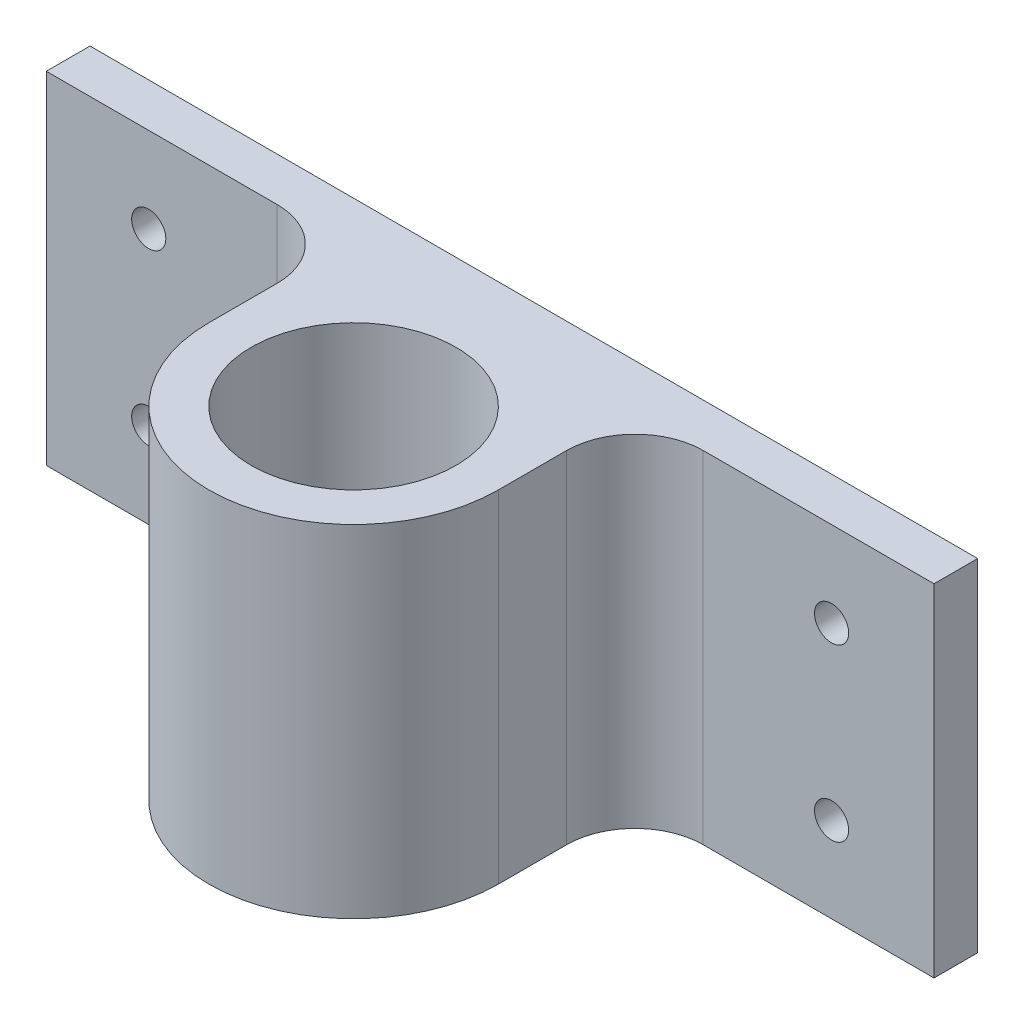
ISO-10303-21;
HEADER;
FILE_DESCRIPTION(('STEP AP214'),'2;1');
FILE_NAME('part.step','',(''),(''),'','','');
FILE_SCHEMA(('AUTOMOTIVE_DESIGN { 1 0 10303 214 1 1 1 1 }'));
ENDSEC;
DATA;
#1=APPLICATION_CONTEXT('core data for automotive mechanical design processes');
#2=APPLICATION_PROTOCOL_DEFINITION('international standard','automotive_design',2000,#1);
#3=PRODUCT_CONTEXT('',#1,'mechanical');
#4=PRODUCT('Part','Part','',(#3));
#5=PRODUCT_RELATED_PRODUCT_CATEGORY('part','',(#4));
#6=PRODUCT_DEFINITION_FORMATION('','',#4);
#7=PRODUCT_DEFINITION_CONTEXT('part definition',#1,'design');
#8=PRODUCT_DEFINITION('design','',#6,#7);
#9=PRODUCT_DEFINITION_SHAPE('','',#8);
#10=(LENGTH_UNIT() NAMED_UNIT(*) SI_UNIT(.MILLI.,.METRE.));
#11=(NAMED_UNIT(*) PLANE_ANGLE_UNIT() SI_UNIT($,.RADIAN.));
#12=(NAMED_UNIT(*) SI_UNIT($,.STERADIAN.) SOLID_ANGLE_UNIT());
#13=UNCERTAINTY_MEASURE_WITH_UNIT(LENGTH_MEASURE(1.E-05),#10,'distance_accuracy_value','');
#14=(GEOMETRIC_REPRESENTATION_CONTEXT(3) GLOBAL_UNCERTAINTY_ASSIGNED_CONTEXT((#13)) GLOBAL_UNIT_ASSIGNED_CONTEXT((#10,
#11,#12)) REPRESENTATION_CONTEXT('',''));
#15=CARTESIAN_POINT('',(0.,0.,0.));
#16=DIRECTION('',(0.,0.,1.));
#17=DIRECTION('',(1.,0.,0.));
#18=AXIS2_PLACEMENT_3D('',#15,#16,#17);
#19=CARTESIAN_POINT('',(-156.,250.,-50.));
#20=DIRECTION('',(0.,1.,0.));
#21=DIRECTION('',(0.,0.,1.));
#22=AXIS2_PLACEMENT_3D('',#19,#20,#21);
#23=PLANE('',#22);
#24=DIRECTION('',(0.,0.,1.));
#25=VECTOR('',#24,1.);
#26=CARTESIAN_POINT('',(-325.,250.,-132.));
#27=LINE('',#26,#25);
#28=CARTESIAN_POINT('',(-325.,250.,-132.));
#29=VERTEX_POINT('',#28);
#30=CARTESIAN_POINT('',(-325.,250.,-100.));
#31=VERTEX_POINT('',#30);
#32=EDGE_CURVE('E165',#29,#31,#27,.T.);
#33=ORIENTED_EDGE('',*,*,#32,.T.);
#34=DIRECTION('',(1.,0.,0.));
#35=VECTOR('',#34,1.);
#36=CARTESIAN_POINT('',(-325.,250.,-100.));
#37=LINE('',#36,#35);
#38=CARTESIAN_POINT('',(-156.,250.,-100.));
#39=VERTEX_POINT('',#38);
#40=EDGE_CURVE('E103',#31,#39,#37,.T.);
#41=ORIENTED_EDGE('',*,*,#40,.T.);
#42=CARTESIAN_POINT('',(-156.,250.,-50.));
#43=DIRECTION('',(0.,-1.,0.));
#44=DIRECTION('',(0.,0.,1.));
#45=AXIS2_PLACEMENT_3D('',#42,#43,#44);
#46=CIRCLE('',#45,50.);
#47=CARTESIAN_POINT('',(-106.,250.,-50.));
#48=VERTEX_POINT('',#47);
#49=EDGE_CURVE('E186',#39,#48,#46,.T.);
#50=ORIENTED_EDGE('',*,*,#49,.T.);
#51=DIRECTION('',(0.,0.,1.));
#52=VECTOR('',#51,1.);
#53=CARTESIAN_POINT('',(-106.,250.,0.));
#54=LINE('',#53,#52);
#55=CARTESIAN_POINT('',(-106.,250.,0.));
#56=VERTEX_POINT('',#55);
#57=EDGE_CURVE('E205',#48,#56,#54,.T.);
#58=ORIENTED_EDGE('',*,*,#57,.T.);
#59=CARTESIAN_POINT('',(0.,250.,0.));
#60=DIRECTION('',(0.,1.,0.));
#61=DIRECTION('',(0.,0.,1.));
#62=AXIS2_PLACEMENT_3D('',#59,#60,#61);
#63=CIRCLE('',#62,106.);
#64=CARTESIAN_POINT('',(106.,250.,0.));
#65=VERTEX_POINT('',#64);
#66=EDGE_CURVE('E202',#56,#65,#63,.T.);
#67=ORIENTED_EDGE('',*,*,#66,.T.);
#68=DIRECTION('',(0.,0.,-1.));
#69=VECTOR('',#68,1.);
#70=CARTESIAN_POINT('',(106.,250.,0.));
#71=LINE('',#70,#69);
#72=CARTESIAN_POINT('',(106.,250.,-50.));
#73=VERTEX_POINT('',#72);
#74=EDGE_CURVE('E204',#65,#73,#71,.T.);
#75=ORIENTED_EDGE('',*,*,#74,.T.);
#76=CARTESIAN_POINT('',(156.,250.,-50.));
#77=DIRECTION('',(0.,-1.,0.));
#78=DIRECTION('',(0.,0.,-1.));
#79=AXIS2_PLACEMENT_3D('',#76,#77,#78);
#80=CIRCLE('',#79,50.);
#81=CARTESIAN_POINT('',(156.,250.,-100.));
#82=VERTEX_POINT('',#81);
#83=EDGE_CURVE('E128',#73,#82,#80,.T.);
#84=ORIENTED_EDGE('',*,*,#83,.T.);
#85=DIRECTION('',(1.,0.,0.));
#86=VECTOR('',#85,1.);
#87=CARTESIAN_POINT('',(156.,250.,-100.));
#88=LINE('',#87,#86);
#89=CARTESIAN_POINT('',(325.,250.,-100.));
#90=VERTEX_POINT('',#89);
#91=EDGE_CURVE('E122',#82,#90,#88,.T.);
#92=ORIENTED_EDGE('',*,*,#91,.T.);
#93=DIRECTION('',(0.,0.,-1.));
#94=VECTOR('',#93,1.);
#95=CARTESIAN_POINT('',(325.,250.,-132.));
#96=LINE('',#95,#94);
#97=CARTESIAN_POINT('',(325.,250.,-132.));
#98=VERTEX_POINT('',#97);
#99=EDGE_CURVE('E126',#90,#98,#96,.T.);
#100=ORIENTED_EDGE('',*,*,#99,.T.);
#101=DIRECTION('',(-1.,0.,0.));
#102=VECTOR('',#101,1.);
#103=CARTESIAN_POINT('',(-325.,250.,-132.));
#104=LINE('',#103,#102);
#105=EDGE_CURVE('E54',#98,#29,#104,.T.);
#106=ORIENTED_EDGE('',*,*,#105,.T.);
#107=EDGE_LOOP('',(#33,#41,#50,#58,#67,#75,#84,#92,#100,#106));
#108=FACE_BOUND('',#107,.T.);
#109=CARTESIAN_POINT('',(0.,250.,0.));
#110=DIRECTION('',(0.,1.,0.));
#111=DIRECTION('',(0.,0.,1.));
#112=AXIS2_PLACEMENT_3D('',#109,#110,#111);
#113=CIRCLE('',#112,75.);
#114=CARTESIAN_POINT('',(0.,250.,75.));
#115=VERTEX_POINT('',#114);
#116=EDGE_CURVE('E150',#115,#115,#113,.T.);
#117=ORIENTED_EDGE('',*,*,#116,.F.);
#118=EDGE_LOOP('',(#117));
#119=FACE_BOUND('',#118,.T.);
#120=ADVANCED_FACE('F37',(#108,#119),#23,.T.);
#121=CARTESIAN_POINT('',(-156.,0.,-50.));
#122=DIRECTION('',(0.,1.,0.));
#123=DIRECTION('',(0.,0.,1.));
#124=AXIS2_PLACEMENT_3D('',#121,#122,#123);
#125=PLANE('',#124);
#126=DIRECTION('',(0.,0.,1.));
#127=VECTOR('',#126,1.);
#128=CARTESIAN_POINT('',(-325.,0.,-132.));
#129=LINE('',#128,#127);
#130=CARTESIAN_POINT('',(-325.,0.,-132.));
#131=VERTEX_POINT('',#130);
#132=CARTESIAN_POINT('',(-325.,0.,-100.));
#133=VERTEX_POINT('',#132);
#134=EDGE_CURVE('E146',#131,#133,#129,.T.);
#135=ORIENTED_EDGE('',*,*,#134,.F.);
#136=DIRECTION('',(-1.,0.,0.));
#137=VECTOR('',#136,1.);
#138=CARTESIAN_POINT('',(-325.,0.,-132.));
#139=LINE('',#138,#137);
#140=CARTESIAN_POINT('',(325.,0.,-132.));
#141=VERTEX_POINT('',#140);
#142=EDGE_CURVE('E95',#141,#131,#139,.T.);
#143=ORIENTED_EDGE('',*,*,#142,.F.);
#144=DIRECTION('',(0.,0.,-1.));
#145=VECTOR('',#144,1.);
#146=CARTESIAN_POINT('',(325.,0.,-132.));
#147=LINE('',#146,#145);
#148=CARTESIAN_POINT('',(325.,0.,-100.));
#149=VERTEX_POINT('',#148);
#150=EDGE_CURVE('E89',#149,#141,#147,.T.);
#151=ORIENTED_EDGE('',*,*,#150,.F.);
#152=DIRECTION('',(1.,0.,0.));
#153=VECTOR('',#152,1.);
#154=CARTESIAN_POINT('',(156.,0.,-100.));
#155=LINE('',#154,#153);
#156=CARTESIAN_POINT('',(156.,0.,-100.));
#157=VERTEX_POINT('',#156);
#158=EDGE_CURVE('E136',#157,#149,#155,.T.);
#159=ORIENTED_EDGE('',*,*,#158,.F.);
#160=CARTESIAN_POINT('',(156.,0.,-50.));
#161=DIRECTION('',(0.,-1.,0.));
#162=DIRECTION('',(0.,0.,-1.));
#163=AXIS2_PLACEMENT_3D('',#160,#161,#162);
#164=CIRCLE('',#163,50.);
#165=CARTESIAN_POINT('',(106.,0.,-50.));
#166=VERTEX_POINT('',#165);
#167=EDGE_CURVE('E160',#166,#157,#164,.T.);
#168=ORIENTED_EDGE('',*,*,#167,.F.);
#169=DIRECTION('',(0.,0.,-1.));
#170=VECTOR('',#169,1.);
#171=CARTESIAN_POINT('',(106.,0.,0.));
#172=LINE('',#171,#170);
#173=CARTESIAN_POINT('',(106.,0.,0.));
#174=VERTEX_POINT('',#173);
#175=EDGE_CURVE('E158',#174,#166,#172,.T.);
#176=ORIENTED_EDGE('',*,*,#175,.F.);
#177=CARTESIAN_POINT('',(0.,0.,0.));
#178=DIRECTION('',(0.,1.,0.));
#179=DIRECTION('',(0.,0.,1.));
#180=AXIS2_PLACEMENT_3D('',#177,#178,#179);
#181=CIRCLE('',#180,106.);
#182=CARTESIAN_POINT('',(-106.,0.,0.));
#183=VERTEX_POINT('',#182);
#184=EDGE_CURVE('E156',#183,#174,#181,.T.);
#185=ORIENTED_EDGE('',*,*,#184,.F.);
#186=DIRECTION('',(0.,0.,1.));
#187=VECTOR('',#186,1.);
#188=CARTESIAN_POINT('',(-106.,0.,0.));
#189=LINE('',#188,#187);
#190=CARTESIAN_POINT('',(-106.,0.,-50.));
#191=VERTEX_POINT('',#190);
#192=EDGE_CURVE('E154',#191,#183,#189,.T.);
#193=ORIENTED_EDGE('',*,*,#192,.F.);
#194=CARTESIAN_POINT('',(-156.,0.,-50.));
#195=DIRECTION('',(0.,-1.,0.));
#196=DIRECTION('',(0.,0.,1.));
#197=AXIS2_PLACEMENT_3D('',#194,#195,#196);
#198=CIRCLE('',#197,50.);
#199=CARTESIAN_POINT('',(-156.,0.,-100.));
#200=VERTEX_POINT('',#199);
#201=EDGE_CURVE('E152',#200,#191,#198,.T.);
#202=ORIENTED_EDGE('',*,*,#201,.F.);
#203=DIRECTION('',(1.,0.,0.));
#204=VECTOR('',#203,1.);
#205=CARTESIAN_POINT('',(-325.,0.,-100.));
#206=LINE('',#205,#204);
#207=EDGE_CURVE('E149',#133,#200,#206,.T.);
#208=ORIENTED_EDGE('',*,*,#207,.F.);
#209=EDGE_LOOP('',(#135,#143,#151,#159,#168,#176,#185,#193,#202,#208));
#210=FACE_BOUND('',#209,.T.);
#211=CARTESIAN_POINT('',(0.,0.,0.));
#212=DIRECTION('',(0.,1.,0.));
#213=DIRECTION('',(0.,0.,1.));
#214=AXIS2_PLACEMENT_3D('',#211,#212,#213);
#215=CIRCLE('',#214,75.);
#216=CARTESIAN_POINT('',(0.,0.,75.));
#217=VERTEX_POINT('',#216);
#218=EDGE_CURVE('E213',#217,#217,#215,.T.);
#219=ORIENTED_EDGE('',*,*,#218,.T.);
#220=EDGE_LOOP('',(#219));
#221=FACE_BOUND('',#220,.T.);
#222=ADVANCED_FACE('F190',(#210,#221),#125,.F.);
#223=CARTESIAN_POINT('',(-325.,250.,-132.));
#224=DIRECTION('',(1.,0.,0.));
#225=DIRECTION('',(0.,0.,-1.));
#226=AXIS2_PLACEMENT_3D('',#223,#224,#225);
#227=PLANE('',#226);
#228=ORIENTED_EDGE('',*,*,#134,.T.);
#229=DIRECTION('',(0.,-1.,0.));
#230=VECTOR('',#229,1.);
#231=CARTESIAN_POINT('',(-325.,250.,-100.));
#232=LINE('',#231,#230);
#233=EDGE_CURVE('E11',#31,#133,#232,.T.);
#234=ORIENTED_EDGE('',*,*,#233,.F.);
#235=ORIENTED_EDGE('',*,*,#32,.F.);
#236=DIRECTION('',(0.,-1.,0.));
#237=VECTOR('',#236,1.);
#238=CARTESIAN_POINT('',(-325.,250.,-132.));
#239=LINE('',#238,#237);
#240=EDGE_CURVE('E142',#29,#131,#239,.T.);
#241=ORIENTED_EDGE('',*,*,#240,.T.);
#242=EDGE_LOOP('',(#228,#234,#235,#241));
#243=FACE_BOUND('',#242,.T.);
#244=ADVANCED_FACE('F39',(#243),#227,.F.);
#245=CARTESIAN_POINT('',(-325.,250.,-100.));
#246=DIRECTION('',(0.,0.,-1.));
#247=DIRECTION('',(-1.,0.,0.));
#248=AXIS2_PLACEMENT_3D('',#245,#246,#247);
#249=PLANE('',#248);
#250=CARTESIAN_POINT('',(-250.,187.5,-100.));
#251=DIRECTION('',(0.,0.,-1.));
#252=DIRECTION('',(-1.,0.,0.));
#253=AXIS2_PLACEMENT_3D('',#250,#251,#252);
#254=CIRCLE('',#253,12.5);
#255=CARTESIAN_POINT('',(-262.5,187.5,-100.));
#256=VERTEX_POINT('',#255);
#257=EDGE_CURVE('E216',#256,#256,#254,.T.);
#258=ORIENTED_EDGE('',*,*,#257,.T.);
#259=EDGE_LOOP('',(#258));
#260=FACE_BOUND('',#259,.T.);
#261=CARTESIAN_POINT('',(-250.,62.5,-100.));
#262=DIRECTION('',(0.,0.,-1.));
#263=DIRECTION('',(-1.,0.,0.));
#264=AXIS2_PLACEMENT_3D('',#261,#262,#263);
#265=CIRCLE('',#264,12.4999999999999);
#266=CARTESIAN_POINT('',(-262.5,62.5,-100.));
#267=VERTEX_POINT('',#266);
#268=EDGE_CURVE('E221',#267,#267,#265,.T.);
#269=ORIENTED_EDGE('',*,*,#268,.T.);
#270=EDGE_LOOP('',(#269));
#271=FACE_BOUND('',#270,.T.);
#272=ORIENTED_EDGE('',*,*,#207,.T.);
#273=DIRECTION('',(0.,-1.,0.));
#274=VECTOR('',#273,1.);
#275=CARTESIAN_POINT('',(-156.,250.,-100.));
#276=LINE('',#275,#274);
#277=EDGE_CURVE('E46',#39,#200,#276,.T.);
#278=ORIENTED_EDGE('',*,*,#277,.F.);
#279=ORIENTED_EDGE('',*,*,#40,.F.);
#280=ORIENTED_EDGE('',*,*,#233,.T.);
#281=EDGE_LOOP('',(#272,#278,#279,#280));
#282=FACE_BOUND('',#281,.T.);
#283=ADVANCED_FACE('F393',(#260,#271,#282),#249,.F.);
#284=CARTESIAN_POINT('',(-156.,250.,-50.));
#285=DIRECTION('',(0.,-1.,0.));
#286=DIRECTION('',(0.,0.,-1.));
#287=AXIS2_PLACEMENT_3D('',#284,#285,#286);
#288=CYLINDRICAL_SURFACE('',#287,50.);
#289=ORIENTED_EDGE('',*,*,#201,.T.);
#290=DIRECTION('',(0.,-1.,0.));
#291=VECTOR('',#290,1.);
#292=CARTESIAN_POINT('',(-106.,250.,-50.));
#293=LINE('',#292,#291);
#294=EDGE_CURVE('E178',#48,#191,#293,.T.);
#295=ORIENTED_EDGE('',*,*,#294,.F.);
#296=ORIENTED_EDGE('',*,*,#49,.F.);
#297=ORIENTED_EDGE('',*,*,#277,.T.);
#298=EDGE_LOOP('',(#289,#295,#296,#297));
#299=FACE_BOUND('',#298,.T.);
#300=ADVANCED_FACE('F184',(#299),#288,.F.);
#301=CARTESIAN_POINT('',(-106.,250.,0.));
#302=DIRECTION('',(1.,0.,0.));
#303=DIRECTION('',(0.,0.,-1.));
#304=AXIS2_PLACEMENT_3D('',#301,#302,#303);
#305=PLANE('',#304);
#306=ORIENTED_EDGE('',*,*,#192,.T.);
#307=DIRECTION('',(0.,-1.,0.));
#308=VECTOR('',#307,1.);
#309=CARTESIAN_POINT('',(-106.,250.,0.));
#310=LINE('',#309,#308);
#311=EDGE_CURVE('E175',#56,#183,#310,.T.);
#312=ORIENTED_EDGE('',*,*,#311,.F.);
#313=ORIENTED_EDGE('',*,*,#57,.F.);
#314=ORIENTED_EDGE('',*,*,#294,.T.);
#315=EDGE_LOOP('',(#306,#312,#313,#314));
#316=FACE_BOUND('',#315,.T.);
#317=ADVANCED_FACE('F196',(#316),#305,.F.);
#318=CARTESIAN_POINT('',(0.,250.,0.));
#319=DIRECTION('',(0.,-1.,0.));
#320=DIRECTION('',(0.,0.,-1.));
#321=AXIS2_PLACEMENT_3D('',#318,#319,#320);
#322=CYLINDRICAL_SURFACE('',#321,106.);
#323=ORIENTED_EDGE('',*,*,#184,.T.);
#324=DIRECTION('',(0.,-1.,0.));
#325=VECTOR('',#324,1.);
#326=CARTESIAN_POINT('',(106.,250.,0.));
#327=LINE('',#326,#325);
#328=EDGE_CURVE('E172',#65,#174,#327,.T.);
#329=ORIENTED_EDGE('',*,*,#328,.F.);
#330=ORIENTED_EDGE('',*,*,#66,.F.);
#331=ORIENTED_EDGE('',*,*,#311,.T.);
#332=EDGE_LOOP('',(#323,#329,#330,#331));
#333=FACE_BOUND('',#332,.T.);
#334=ADVANCED_FACE('F200',(#333),#322,.T.);
#335=CARTESIAN_POINT('',(106.,250.,0.));
#336=DIRECTION('',(-1.,0.,0.));
#337=DIRECTION('',(0.,0.,1.));
#338=AXIS2_PLACEMENT_3D('',#335,#336,#337);
#339=PLANE('',#338);
#340=ORIENTED_EDGE('',*,*,#175,.T.);
#341=DIRECTION('',(0.,-1.,0.));
#342=VECTOR('',#341,1.);
#343=CARTESIAN_POINT('',(106.,250.,-50.));
#344=LINE('',#343,#342);
#345=EDGE_CURVE('E169',#73,#166,#344,.T.);
#346=ORIENTED_EDGE('',*,*,#345,.F.);
#347=ORIENTED_EDGE('',*,*,#74,.F.);
#348=ORIENTED_EDGE('',*,*,#328,.T.);
#349=EDGE_LOOP('',(#340,#346,#347,#348));
#350=FACE_BOUND('',#349,.T.);
#351=ADVANCED_FACE('F269',(#350),#339,.F.);
#352=CARTESIAN_POINT('',(156.,250.,-50.));
#353=DIRECTION('',(0.,-1.,0.));
#354=DIRECTION('',(0.,0.,-1.));
#355=AXIS2_PLACEMENT_3D('',#352,#353,#354);
#356=CYLINDRICAL_SURFACE('',#355,50.);
#357=ORIENTED_EDGE('',*,*,#167,.T.);
#358=DIRECTION('',(0.,-1.,0.));
#359=VECTOR('',#358,1.);
#360=CARTESIAN_POINT('',(156.,250.,-100.));
#361=LINE('',#360,#359);
#362=EDGE_CURVE('E137',#82,#157,#361,.T.);
#363=ORIENTED_EDGE('',*,*,#362,.F.);
#364=ORIENTED_EDGE('',*,*,#83,.F.);
#365=ORIENTED_EDGE('',*,*,#345,.T.);
#366=EDGE_LOOP('',(#357,#363,#364,#365));
#367=FACE_BOUND('',#366,.T.);
#368=ADVANCED_FACE('F261',(#367),#356,.F.);
#369=CARTESIAN_POINT('',(156.,250.,-100.));
#370=DIRECTION('',(0.,0.,-1.));
#371=DIRECTION('',(-1.,0.,0.));
#372=AXIS2_PLACEMENT_3D('',#369,#370,#371);
#373=PLANE('',#372);
#374=CARTESIAN_POINT('',(250.,62.5,-100.));
#375=DIRECTION('',(0.,0.,-1.));
#376=DIRECTION('',(-1.,0.,0.));
#377=AXIS2_PLACEMENT_3D('',#374,#375,#376);
#378=CIRCLE('',#377,12.5);
#379=CARTESIAN_POINT('',(237.5,62.5,-100.));
#380=VERTEX_POINT('',#379);
#381=EDGE_CURVE('E224',#380,#380,#378,.T.);
#382=ORIENTED_EDGE('',*,*,#381,.T.);
#383=EDGE_LOOP('',(#382));
#384=FACE_BOUND('',#383,.T.);
#385=CARTESIAN_POINT('',(250.,187.5,-100.));
#386=DIRECTION('',(0.,0.,-1.));
#387=DIRECTION('',(-1.,0.,0.));
#388=AXIS2_PLACEMENT_3D('',#385,#386,#387);
#389=CIRCLE('',#388,12.5);
#390=CARTESIAN_POINT('',(237.5,187.5,-100.));
#391=VERTEX_POINT('',#390);
#392=EDGE_CURVE('E227',#391,#391,#389,.T.);
#393=ORIENTED_EDGE('',*,*,#392,.T.);
#394=EDGE_LOOP('',(#393));
#395=FACE_BOUND('',#394,.T.);
#396=ORIENTED_EDGE('',*,*,#158,.T.);
#397=DIRECTION('',(0.,-1.,0.));
#398=VECTOR('',#397,1.);
#399=CARTESIAN_POINT('',(325.,250.,-100.));
#400=LINE('',#399,#398);
#401=EDGE_CURVE('E133',#90,#149,#400,.T.);
#402=ORIENTED_EDGE('',*,*,#401,.F.);
#403=ORIENTED_EDGE('',*,*,#91,.F.);
#404=ORIENTED_EDGE('',*,*,#362,.T.);
#405=EDGE_LOOP('',(#396,#402,#403,#404));
#406=FACE_BOUND('',#405,.T.);
#407=ADVANCED_FACE('F134',(#384,#395,#406),#373,.F.);
#408=CARTESIAN_POINT('',(325.,250.,-132.));
#409=DIRECTION('',(-1.,0.,0.));
#410=DIRECTION('',(0.,0.,1.));
#411=AXIS2_PLACEMENT_3D('',#408,#409,#410);
#412=PLANE('',#411);
#413=ORIENTED_EDGE('',*,*,#150,.T.);
#414=DIRECTION('',(0.,-1.,0.));
#415=VECTOR('',#414,1.);
#416=CARTESIAN_POINT('',(325.,250.,-132.));
#417=LINE('',#416,#415);
#418=EDGE_CURVE('E138',#98,#141,#417,.T.);
#419=ORIENTED_EDGE('',*,*,#418,.F.);
#420=ORIENTED_EDGE('',*,*,#99,.F.);
#421=ORIENTED_EDGE('',*,*,#401,.T.);
#422=EDGE_LOOP('',(#413,#419,#420,#421));
#423=FACE_BOUND('',#422,.T.);
#424=ADVANCED_FACE('F140',(#423),#412,.F.);
#425=CARTESIAN_POINT('',(-325.,250.,-132.));
#426=DIRECTION('',(0.,0.,1.));
#427=DIRECTION('',(1.,0.,0.));
#428=AXIS2_PLACEMENT_3D('',#425,#426,#427);
#429=PLANE('',#428);
#430=CARTESIAN_POINT('',(-250.,187.5,-132.));
#431=DIRECTION('',(0.,0.,-1.));
#432=DIRECTION('',(1.,0.,0.));
#433=AXIS2_PLACEMENT_3D('',#430,#431,#432);
#434=CIRCLE('',#433,12.5);
#435=CARTESIAN_POINT('',(-237.5,187.5,-132.));
#436=VERTEX_POINT('',#435);
#437=EDGE_CURVE('E234',#436,#436,#434,.T.);
#438=ORIENTED_EDGE('',*,*,#437,.F.);
#439=EDGE_LOOP('',(#438));
#440=FACE_BOUND('',#439,.T.);
#441=CARTESIAN_POINT('',(-250.,62.5,-132.));
#442=DIRECTION('',(0.,0.,-1.));
#443=DIRECTION('',(1.,0.,0.));
#444=AXIS2_PLACEMENT_3D('',#441,#442,#443);
#445=CIRCLE('',#444,12.4999999999999);
#446=CARTESIAN_POINT('',(-237.5,62.5,-132.));
#447=VERTEX_POINT('',#446);
#448=EDGE_CURVE('E237',#447,#447,#445,.T.);
#449=ORIENTED_EDGE('',*,*,#448,.F.);
#450=EDGE_LOOP('',(#449));
#451=FACE_BOUND('',#450,.T.);
#452=CARTESIAN_POINT('',(250.,62.5,-132.));
#453=DIRECTION('',(0.,0.,-1.));
#454=DIRECTION('',(-1.,0.,0.));
#455=AXIS2_PLACEMENT_3D('',#452,#453,#454);
#456=CIRCLE('',#455,12.5);
#457=CARTESIAN_POINT('',(237.5,62.5,-132.));
#458=VERTEX_POINT('',#457);
#459=EDGE_CURVE('E233',#458,#458,#456,.T.);
#460=ORIENTED_EDGE('',*,*,#459,.F.);
#461=EDGE_LOOP('',(#460));
#462=FACE_BOUND('',#461,.T.);
#463=CARTESIAN_POINT('',(250.,187.5,-132.));
#464=DIRECTION('',(0.,0.,-1.));
#465=DIRECTION('',(-1.,0.,0.));
#466=AXIS2_PLACEMENT_3D('',#463,#464,#465);
#467=CIRCLE('',#466,12.5);
#468=CARTESIAN_POINT('',(237.5,187.5,-132.));
#469=VERTEX_POINT('',#468);
#470=EDGE_CURVE('E230',#469,#469,#467,.T.);
#471=ORIENTED_EDGE('',*,*,#470,.F.);
#472=EDGE_LOOP('',(#471));
#473=FACE_BOUND('',#472,.T.);
#474=ORIENTED_EDGE('',*,*,#142,.T.);
#475=ORIENTED_EDGE('',*,*,#240,.F.);
#476=ORIENTED_EDGE('',*,*,#105,.F.);
#477=ORIENTED_EDGE('',*,*,#418,.T.);
#478=EDGE_LOOP('',(#474,#475,#476,#477));
#479=FACE_BOUND('',#478,.T.);
#480=ADVANCED_FACE('F246',(#440,#451,#462,#473,#479),#429,.F.);
#481=CARTESIAN_POINT('',(0.,250.,0.));
#482=DIRECTION('',(0.,-1.,0.));
#483=DIRECTION('',(0.,0.,-1.));
#484=AXIS2_PLACEMENT_3D('',#481,#482,#483);
#485=CYLINDRICAL_SURFACE('',#484,75.);
#486=ORIENTED_EDGE('',*,*,#116,.T.);
#487=EDGE_LOOP('',(#486));
#488=FACE_BOUND('',#487,.T.);
#489=ORIENTED_EDGE('',*,*,#218,.F.);
#490=EDGE_LOOP('',(#489));
#491=FACE_BOUND('',#490,.T.);
#492=ADVANCED_FACE('F249',(#488,#491),#485,.F.);
#493=CARTESIAN_POINT('',(250.,187.5,118.));
#494=DIRECTION('',(0.,0.,-1.));
#495=DIRECTION('',(-1.,0.,0.));
#496=AXIS2_PLACEMENT_3D('',#493,#494,#495);
#497=CYLINDRICAL_SURFACE('',#496,12.5);
#498=ORIENTED_EDGE('',*,*,#470,.T.);
#499=EDGE_LOOP('',(#498));
#500=FACE_BOUND('',#499,.T.);
#501=ORIENTED_EDGE('',*,*,#392,.F.);
#502=EDGE_LOOP('',(#501));
#503=FACE_BOUND('',#502,.T.);
#504=ADVANCED_FACE('F254',(#500,#503),#497,.F.);
#505=CARTESIAN_POINT('',(250.,62.5,118.));
#506=DIRECTION('',(0.,0.,-1.));
#507=DIRECTION('',(-1.,0.,0.));
#508=AXIS2_PLACEMENT_3D('',#505,#506,#507);
#509=CYLINDRICAL_SURFACE('',#508,12.5);
#510=ORIENTED_EDGE('',*,*,#459,.T.);
#511=EDGE_LOOP('',(#510));
#512=FACE_BOUND('',#511,.T.);
#513=ORIENTED_EDGE('',*,*,#381,.F.);
#514=EDGE_LOOP('',(#513));
#515=FACE_BOUND('',#514,.T.);
#516=ADVANCED_FACE('F243',(#512,#515),#509,.F.);
#517=CARTESIAN_POINT('',(-250.,62.5,118.));
#518=DIRECTION('',(0.,0.,-1.));
#519=DIRECTION('',(-1.,0.,0.));
#520=AXIS2_PLACEMENT_3D('',#517,#518,#519);
#521=CYLINDRICAL_SURFACE('',#520,12.4999999999999);
#522=ORIENTED_EDGE('',*,*,#448,.T.);
#523=EDGE_LOOP('',(#522));
#524=FACE_BOUND('',#523,.T.);
#525=ORIENTED_EDGE('',*,*,#268,.F.);
#526=EDGE_LOOP('',(#525));
#527=FACE_BOUND('',#526,.T.);
#528=ADVANCED_FACE('F285',(#524,#527),#521,.F.);
#529=CARTESIAN_POINT('',(-250.,187.5,118.));
#530=DIRECTION('',(0.,0.,-1.));
#531=DIRECTION('',(-1.,0.,0.));
#532=AXIS2_PLACEMENT_3D('',#529,#530,#531);
#533=CYLINDRICAL_SURFACE('',#532,12.5);
#534=ORIENTED_EDGE('',*,*,#437,.T.);
#535=EDGE_LOOP('',(#534));
#536=FACE_BOUND('',#535,.T.);
#537=ORIENTED_EDGE('',*,*,#257,.F.);
#538=EDGE_LOOP('',(#537));
#539=FACE_BOUND('',#538,.T.);
#540=ADVANCED_FACE('F282',(#536,#539),#533,.F.);
#541=CLOSED_SHELL('',(#120,#222,#244,#283,#300,#317,#334,#351,#368,#407,#424,#480,#492,#504,
#516,#528,#540));
#542=MANIFOLD_SOLID_BREP('B2',#541);
#543=ADVANCED_BREP_SHAPE_REPRESENTATION('',(#18,#542),#14);
#544=SHAPE_DEFINITION_REPRESENTATION(#9,#543);
ENDSEC;
END-ISO-10303-21;
